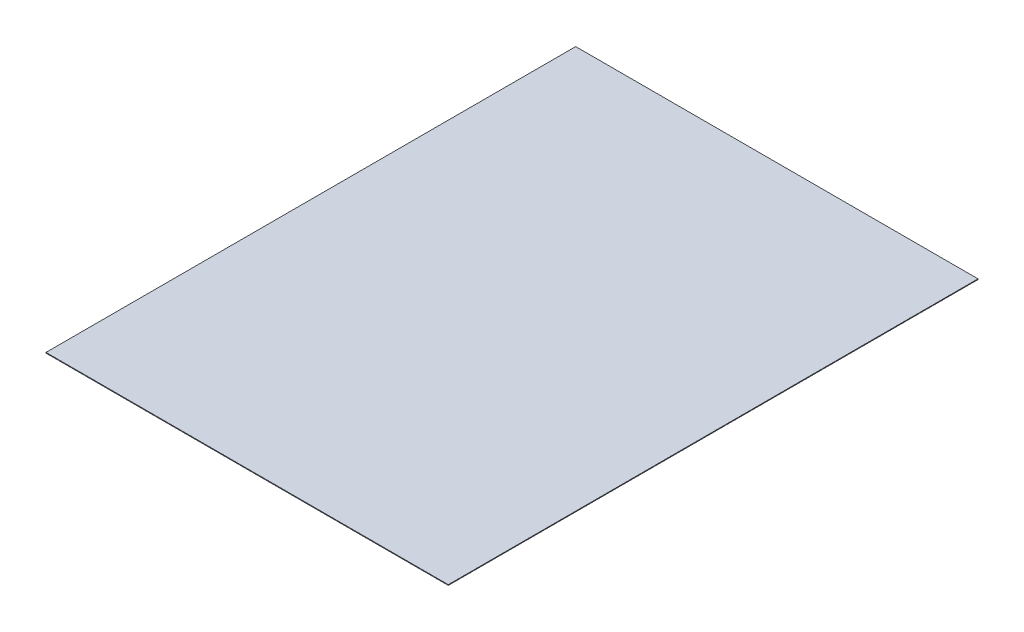
ISO-10303-21;
HEADER;
FILE_DESCRIPTION(('STEP AP214'),'2;1');
FILE_NAME('part.step','',(''),(''),'','','');
FILE_SCHEMA(('AUTOMOTIVE_DESIGN { 1 0 10303 214 1 1 1 1 }'));
ENDSEC;
DATA;
#1=APPLICATION_CONTEXT('core data for automotive mechanical design processes');
#2=APPLICATION_PROTOCOL_DEFINITION('international standard','automotive_design',2000,#1);
#3=PRODUCT_CONTEXT('',#1,'mechanical');
#4=PRODUCT('Part','Part','',(#3));
#5=PRODUCT_RELATED_PRODUCT_CATEGORY('part','',(#4));
#6=PRODUCT_DEFINITION_FORMATION('','',#4);
#7=PRODUCT_DEFINITION_CONTEXT('part definition',#1,'design');
#8=PRODUCT_DEFINITION('design','',#6,#7);
#9=PRODUCT_DEFINITION_SHAPE('','',#8);
#10=(LENGTH_UNIT() NAMED_UNIT(*) SI_UNIT(.MILLI.,.METRE.));
#11=(NAMED_UNIT(*) PLANE_ANGLE_UNIT() SI_UNIT($,.RADIAN.));
#12=(NAMED_UNIT(*) SI_UNIT($,.STERADIAN.) SOLID_ANGLE_UNIT());
#13=UNCERTAINTY_MEASURE_WITH_UNIT(LENGTH_MEASURE(1.E-05),#10,'distance_accuracy_value','');
#14=(GEOMETRIC_REPRESENTATION_CONTEXT(3) GLOBAL_UNCERTAINTY_ASSIGNED_CONTEXT((#13)) GLOBAL_UNIT_ASSIGNED_CONTEXT((#10,
#11,#12)) REPRESENTATION_CONTEXT('',''));
#15=CARTESIAN_POINT('',(0.,0.,0.));
#16=DIRECTION('',(0.,0.,1.));
#17=DIRECTION('',(1.,0.,0.));
#18=AXIS2_PLACEMENT_3D('',#15,#16,#17);
#19=CARTESIAN_POINT('',(3000.,10.,-3950.));
#20=DIRECTION('',(-1.,0.,0.));
#21=DIRECTION('',(0.,0.,1.));
#22=AXIS2_PLACEMENT_3D('',#19,#20,#21);
#23=PLANE('',#22);
#24=DIRECTION('',(0.,0.,-1.));
#25=VECTOR('',#24,1.);
#26=CARTESIAN_POINT('',(3000.,0.,-3950.));
#27=LINE('',#26,#25);
#28=CARTESIAN_POINT('',(3000.,0.,3950.));
#29=VERTEX_POINT('',#28);
#30=CARTESIAN_POINT('',(3000.,0.,-3950.));
#31=VERTEX_POINT('',#30);
#32=EDGE_CURVE('E95',#29,#31,#27,.T.);
#33=ORIENTED_EDGE('',*,*,#32,.T.);
#34=DIRECTION('',(0.,-1.,0.));
#35=VECTOR('',#34,1.);
#36=CARTESIAN_POINT('',(3000.,10.,-3950.));
#37=LINE('',#36,#35);
#38=CARTESIAN_POINT('',(3000.,10.,-3950.));
#39=VERTEX_POINT('',#38);
#40=EDGE_CURVE('E11',#39,#31,#37,.T.);
#41=ORIENTED_EDGE('',*,*,#40,.F.);
#42=DIRECTION('',(0.,0.,-1.));
#43=VECTOR('',#42,1.);
#44=CARTESIAN_POINT('',(3000.,10.,-3950.));
#45=LINE('',#44,#43);
#46=CARTESIAN_POINT('',(3000.,10.,3950.));
#47=VERTEX_POINT('',#46);
#48=EDGE_CURVE('E83',#47,#39,#45,.T.);
#49=ORIENTED_EDGE('',*,*,#48,.F.);
#50=DIRECTION('',(0.,-1.,0.));
#51=VECTOR('',#50,1.);
#52=CARTESIAN_POINT('',(3000.,10.,3950.));
#53=LINE('',#52,#51);
#54=EDGE_CURVE('E91',#47,#29,#53,.T.);
#55=ORIENTED_EDGE('',*,*,#54,.T.);
#56=EDGE_LOOP('',(#33,#41,#49,#55));
#57=FACE_BOUND('',#56,.T.);
#58=ADVANCED_FACE('F32',(#57),#23,.F.);
#59=CARTESIAN_POINT('',(-3000.,10.,-3950.));
#60=DIRECTION('',(0.,0.,1.));
#61=DIRECTION('',(1.,0.,0.));
#62=AXIS2_PLACEMENT_3D('',#59,#60,#61);
#63=PLANE('',#62);
#64=DIRECTION('',(-1.,0.,0.));
#65=VECTOR('',#64,1.);
#66=CARTESIAN_POINT('',(-3000.,0.,-3950.));
#67=LINE('',#66,#65);
#68=CARTESIAN_POINT('',(-3000.,0.,-3950.));
#69=VERTEX_POINT('',#68);
#70=EDGE_CURVE('E87',#31,#69,#67,.T.);
#71=ORIENTED_EDGE('',*,*,#70,.T.);
#72=DIRECTION('',(0.,-1.,0.));
#73=VECTOR('',#72,1.);
#74=CARTESIAN_POINT('',(-3000.,10.,-3950.));
#75=LINE('',#74,#73);
#76=CARTESIAN_POINT('',(-3000.,10.,-3950.));
#77=VERTEX_POINT('',#76);
#78=EDGE_CURVE('E40',#77,#69,#75,.T.);
#79=ORIENTED_EDGE('',*,*,#78,.F.);
#80=DIRECTION('',(-1.,0.,0.));
#81=VECTOR('',#80,1.);
#82=CARTESIAN_POINT('',(-3000.,10.,-3950.));
#83=LINE('',#82,#81);
#84=EDGE_CURVE('E78',#39,#77,#83,.T.);
#85=ORIENTED_EDGE('',*,*,#84,.F.);
#86=ORIENTED_EDGE('',*,*,#40,.T.);
#87=EDGE_LOOP('',(#71,#79,#85,#86));
#88=FACE_BOUND('',#87,.T.);
#89=ADVANCED_FACE('F86',(#88),#63,.F.);
#90=CARTESIAN_POINT('',(-3000.,10.,-3950.));
#91=DIRECTION('',(1.,0.,0.));
#92=DIRECTION('',(0.,0.,-1.));
#93=AXIS2_PLACEMENT_3D('',#90,#91,#92);
#94=PLANE('',#93);
#95=DIRECTION('',(0.,0.,1.));
#96=VECTOR('',#95,1.);
#97=CARTESIAN_POINT('',(-3000.,0.,-3950.));
#98=LINE('',#97,#96);
#99=CARTESIAN_POINT('',(-3000.,0.,3950.));
#100=VERTEX_POINT('',#99);
#101=EDGE_CURVE('E65',#69,#100,#98,.T.);
#102=ORIENTED_EDGE('',*,*,#101,.T.);
#103=DIRECTION('',(0.,-1.,0.));
#104=VECTOR('',#103,1.);
#105=CARTESIAN_POINT('',(-3000.,10.,3950.));
#106=LINE('',#105,#104);
#107=CARTESIAN_POINT('',(-3000.,10.,3950.));
#108=VERTEX_POINT('',#107);
#109=EDGE_CURVE('E88',#108,#100,#106,.T.);
#110=ORIENTED_EDGE('',*,*,#109,.F.);
#111=DIRECTION('',(0.,0.,1.));
#112=VECTOR('',#111,1.);
#113=CARTESIAN_POINT('',(-3000.,10.,-3950.));
#114=LINE('',#113,#112);
#115=EDGE_CURVE('E81',#77,#108,#114,.T.);
#116=ORIENTED_EDGE('',*,*,#115,.F.);
#117=ORIENTED_EDGE('',*,*,#78,.T.);
#118=EDGE_LOOP('',(#102,#110,#116,#117));
#119=FACE_BOUND('',#118,.T.);
#120=ADVANCED_FACE('F89',(#119),#94,.F.);
#121=CARTESIAN_POINT('',(-3000.,10.,3950.));
#122=DIRECTION('',(0.,0.,-1.));
#123=DIRECTION('',(-1.,0.,0.));
#124=AXIS2_PLACEMENT_3D('',#121,#122,#123);
#125=PLANE('',#124);
#126=DIRECTION('',(1.,0.,0.));
#127=VECTOR('',#126,1.);
#128=CARTESIAN_POINT('',(-3000.,0.,3950.));
#129=LINE('',#128,#127);
#130=EDGE_CURVE('E71',#100,#29,#129,.T.);
#131=ORIENTED_EDGE('',*,*,#130,.T.);
#132=ORIENTED_EDGE('',*,*,#54,.F.);
#133=DIRECTION('',(1.,0.,0.));
#134=VECTOR('',#133,1.);
#135=CARTESIAN_POINT('',(-3000.,10.,3950.));
#136=LINE('',#135,#134);
#137=EDGE_CURVE('E48',#108,#47,#136,.T.);
#138=ORIENTED_EDGE('',*,*,#137,.F.);
#139=ORIENTED_EDGE('',*,*,#109,.T.);
#140=EDGE_LOOP('',(#131,#132,#138,#139));
#141=FACE_BOUND('',#140,.T.);
#142=ADVANCED_FACE('F102',(#141),#125,.F.);
#143=CARTESIAN_POINT('',(0.,10.,0.));
#144=DIRECTION('',(0.,1.,0.));
#145=DIRECTION('',(0.,0.,1.));
#146=AXIS2_PLACEMENT_3D('',#143,#144,#145);
#147=PLANE('',#146);
#148=ORIENTED_EDGE('',*,*,#48,.T.);
#149=ORIENTED_EDGE('',*,*,#84,.T.);
#150=ORIENTED_EDGE('',*,*,#115,.T.);
#151=ORIENTED_EDGE('',*,*,#137,.T.);
#152=EDGE_LOOP('',(#148,#149,#150,#151));
#153=FACE_BOUND('',#152,.T.);
#154=ADVANCED_FACE('F79',(#153),#147,.T.);
#155=CARTESIAN_POINT('',(0.,0.,0.));
#156=DIRECTION('',(0.,1.,0.));
#157=DIRECTION('',(0.,0.,1.));
#158=AXIS2_PLACEMENT_3D('',#155,#156,#157);
#159=PLANE('',#158);
#160=ORIENTED_EDGE('',*,*,#32,.F.);
#161=ORIENTED_EDGE('',*,*,#130,.F.);
#162=ORIENTED_EDGE('',*,*,#101,.F.);
#163=ORIENTED_EDGE('',*,*,#70,.F.);
#164=EDGE_LOOP('',(#160,#161,#162,#163));
#165=FACE_BOUND('',#164,.T.);
#166=ADVANCED_FACE('F105',(#165),#159,.F.);
#167=CLOSED_SHELL('',(#58,#89,#120,#142,#154,#166));
#168=MANIFOLD_SOLID_BREP('B2',#167);
#169=ADVANCED_BREP_SHAPE_REPRESENTATION('',(#18,#168),#14);
#170=SHAPE_DEFINITION_REPRESENTATION(#9,#169);
ENDSEC;
END-ISO-10303-21;
